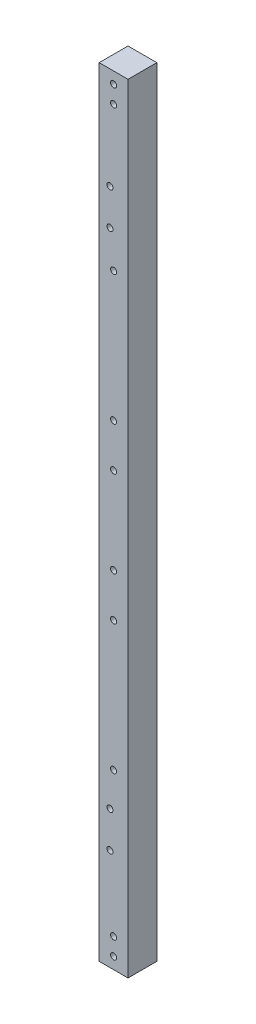
ISO-10303-21;
HEADER;
FILE_DESCRIPTION(('STEP AP214'),'2;1');
FILE_NAME('part.step','',(''),(''),'','','');
FILE_SCHEMA(('AUTOMOTIVE_DESIGN { 1 0 10303 214 1 1 1 1 }'));
ENDSEC;
DATA;
#1=APPLICATION_CONTEXT('core data for automotive mechanical design processes');
#2=APPLICATION_PROTOCOL_DEFINITION('international standard','automotive_design',2000,#1);
#3=PRODUCT_CONTEXT('',#1,'mechanical');
#4=PRODUCT('Part','Part','',(#3));
#5=PRODUCT_RELATED_PRODUCT_CATEGORY('part','',(#4));
#6=PRODUCT_DEFINITION_FORMATION('','',#4);
#7=PRODUCT_DEFINITION_CONTEXT('part definition',#1,'design');
#8=PRODUCT_DEFINITION('design','',#6,#7);
#9=PRODUCT_DEFINITION_SHAPE('','',#8);
#10=(LENGTH_UNIT() NAMED_UNIT(*) SI_UNIT(.MILLI.,.METRE.));
#11=(NAMED_UNIT(*) PLANE_ANGLE_UNIT() SI_UNIT($,.RADIAN.));
#12=(NAMED_UNIT(*) SI_UNIT($,.STERADIAN.) SOLID_ANGLE_UNIT());
#13=UNCERTAINTY_MEASURE_WITH_UNIT(LENGTH_MEASURE(1.E-05),#10,'distance_accuracy_value','');
#14=(GEOMETRIC_REPRESENTATION_CONTEXT(3) GLOBAL_UNCERTAINTY_ASSIGNED_CONTEXT((#13)) GLOBAL_UNIT_ASSIGNED_CONTEXT((#10,
#11,#12)) REPRESENTATION_CONTEXT('',''));
#15=CARTESIAN_POINT('',(0.,0.,0.));
#16=DIRECTION('',(0.,0.,1.));
#17=DIRECTION('',(1.,0.,0.));
#18=AXIS2_PLACEMENT_3D('',#15,#16,#17);
#19=CARTESIAN_POINT('',(-43.8461538461538,540.,-73.4615384615385));
#20=DIRECTION('',(1.,0.,0.));
#21=DIRECTION('',(0.,0.,-1.));
#22=AXIS2_PLACEMENT_3D('',#19,#20,#21);
#23=PLANE('',#22);
#24=DIRECTION('',(0.,0.,1.));
#25=VECTOR('',#24,1.);
#26=CARTESIAN_POINT('',(-43.8461538461538,0.,-73.4615384615385));
#27=LINE('',#26,#25);
#28=CARTESIAN_POINT('',(-43.8461538461538,0.,-73.4615384615385));
#29=VERTEX_POINT('',#28);
#30=CARTESIAN_POINT('',(-43.8461538461538,0.,-53.4615384615385));
#31=VERTEX_POINT('',#30);
#32=EDGE_CURVE('E104',#29,#31,#27,.T.);
#33=ORIENTED_EDGE('',*,*,#32,.T.);
#34=DIRECTION('',(0.,-1.,0.));
#35=VECTOR('',#34,1.);
#36=CARTESIAN_POINT('',(-43.8461538461538,540.,-53.4615384615385));
#37=LINE('',#36,#35);
#38=CARTESIAN_POINT('',(-43.8461538461538,540.,-53.4615384615385));
#39=VERTEX_POINT('',#38);
#40=EDGE_CURVE('E11',#39,#31,#37,.T.);
#41=ORIENTED_EDGE('',*,*,#40,.F.);
#42=DIRECTION('',(0.,0.,1.));
#43=VECTOR('',#42,1.);
#44=CARTESIAN_POINT('',(-43.8461538461538,540.,-73.4615384615385));
#45=LINE('',#44,#43);
#46=CARTESIAN_POINT('',(-43.8461538461538,540.,-73.4615384615385));
#47=VERTEX_POINT('',#46);
#48=EDGE_CURVE('E91',#47,#39,#45,.T.);
#49=ORIENTED_EDGE('',*,*,#48,.F.);
#50=DIRECTION('',(0.,-1.,0.));
#51=VECTOR('',#50,1.);
#52=CARTESIAN_POINT('',(-43.8461538461538,540.,-73.4615384615385));
#53=LINE('',#52,#51);
#54=EDGE_CURVE('E100',#47,#29,#53,.T.);
#55=ORIENTED_EDGE('',*,*,#54,.T.);
#56=EDGE_LOOP('',(#33,#41,#49,#55));
#57=FACE_BOUND('',#56,.T.);
#58=ADVANCED_FACE('F38',(#57),#23,.F.);
#59=CARTESIAN_POINT('',(-43.8461538461538,540.,-53.4615384615385));
#60=DIRECTION('',(0.,0.,-1.));
#61=DIRECTION('',(-1.,0.,0.));
#62=AXIS2_PLACEMENT_3D('',#59,#60,#61);
#63=PLANE('',#62);
#64=CARTESIAN_POINT('',(-33.8461538461538,8.,-53.4615384615385));
#65=DIRECTION('',(0.,0.,1.));
#66=DIRECTION('',(1.,0.,0.));
#67=AXIS2_PLACEMENT_3D('',#64,#65,#66);
#68=CIRCLE('',#67,2.1);
#69=CARTESIAN_POINT('',(-31.7461538461538,8.,-53.4615384615385));
#70=VERTEX_POINT('',#69);
#71=EDGE_CURVE('E117',#70,#70,#68,.T.);
#72=ORIENTED_EDGE('',*,*,#71,.F.);
#73=EDGE_LOOP('',(#72));
#74=FACE_BOUND('',#73,.T.);
#75=CARTESIAN_POINT('',(-33.8461538461538,20.,-53.4615384615385));
#76=DIRECTION('',(0.,0.,1.));
#77=DIRECTION('',(1.,0.,0.));
#78=AXIS2_PLACEMENT_3D('',#75,#76,#77);
#79=CIRCLE('',#78,2.1);
#80=CARTESIAN_POINT('',(-31.7461538461538,20.,-53.4615384615385));
#81=VERTEX_POINT('',#80);
#82=EDGE_CURVE('E254',#81,#81,#79,.T.);
#83=ORIENTED_EDGE('',*,*,#82,.F.);
#84=EDGE_LOOP('',(#83));
#85=FACE_BOUND('',#84,.T.);
#86=CARTESIAN_POINT('',(-33.8461538461538,520.,-53.4615384615385));
#87=DIRECTION('',(0.,0.,1.));
#88=DIRECTION('',(-1.,0.,0.));
#89=AXIS2_PLACEMENT_3D('',#86,#87,#88);
#90=CIRCLE('',#89,2.10000000000001);
#91=CARTESIAN_POINT('',(-35.9461538461538,520.,-53.4615384615385));
#92=VERTEX_POINT('',#91);
#93=EDGE_CURVE('E257',#92,#92,#90,.T.);
#94=ORIENTED_EDGE('',*,*,#93,.F.);
#95=EDGE_LOOP('',(#94));
#96=FACE_BOUND('',#95,.T.);
#97=CARTESIAN_POINT('',(-33.8461538461538,532.,-53.4615384615385));
#98=DIRECTION('',(0.,0.,1.));
#99=DIRECTION('',(-1.,0.,0.));
#100=AXIS2_PLACEMENT_3D('',#97,#98,#99);
#101=CIRCLE('',#100,2.09999999999998);
#102=CARTESIAN_POINT('',(-35.9461538461538,532.,-53.4615384615385));
#103=VERTEX_POINT('',#102);
#104=EDGE_CURVE('E262',#103,#103,#101,.T.);
#105=ORIENTED_EDGE('',*,*,#104,.F.);
#106=EDGE_LOOP('',(#105));
#107=FACE_BOUND('',#106,.T.);
#108=CARTESIAN_POINT('',(-36.3461538461538,70.5,-53.4615384615385));
#109=DIRECTION('',(0.,0.,1.));
#110=DIRECTION('',(1.,0.,0.));
#111=AXIS2_PLACEMENT_3D('',#108,#109,#110);
#112=CIRCLE('',#111,2.1);
#113=CARTESIAN_POINT('',(-34.2461538461538,70.5,-53.4615384615385));
#114=VERTEX_POINT('',#113);
#115=EDGE_CURVE('E267',#114,#114,#112,.T.);
#116=ORIENTED_EDGE('',*,*,#115,.F.);
#117=EDGE_LOOP('',(#116));
#118=FACE_BOUND('',#117,.T.);
#119=CARTESIAN_POINT('',(-36.3461538461538,95.5,-53.4615384615385));
#120=DIRECTION('',(0.,0.,1.));
#121=DIRECTION('',(1.,0.,0.));
#122=AXIS2_PLACEMENT_3D('',#119,#120,#121);
#123=CIRCLE('',#122,2.1);
#124=CARTESIAN_POINT('',(-34.2461538461538,95.5,-53.4615384615385));
#125=VERTEX_POINT('',#124);
#126=EDGE_CURVE('E273',#125,#125,#123,.T.);
#127=ORIENTED_EDGE('',*,*,#126,.F.);
#128=EDGE_LOOP('',(#127));
#129=FACE_BOUND('',#128,.T.);
#130=CARTESIAN_POINT('',(-36.3461538461538,444.5,-53.4615384615385));
#131=DIRECTION('',(0.,0.,1.));
#132=DIRECTION('',(-1.,0.,0.));
#133=AXIS2_PLACEMENT_3D('',#130,#131,#132);
#134=CIRCLE('',#133,2.09999999999999);
#135=CARTESIAN_POINT('',(-38.4461538461538,444.5,-53.4615384615385));
#136=VERTEX_POINT('',#135);
#137=EDGE_CURVE('E133',#136,#136,#134,.T.);
#138=ORIENTED_EDGE('',*,*,#137,.F.);
#139=EDGE_LOOP('',(#138));
#140=FACE_BOUND('',#139,.T.);
#141=CARTESIAN_POINT('',(-36.3461538461538,469.5,-53.4615384615385));
#142=DIRECTION('',(0.,0.,1.));
#143=DIRECTION('',(-1.,0.,0.));
#144=AXIS2_PLACEMENT_3D('',#141,#142,#143);
#145=CIRCLE('',#144,2.09999999999999);
#146=CARTESIAN_POINT('',(-38.4461538461538,469.5,-53.4615384615385));
#147=VERTEX_POINT('',#146);
#148=EDGE_CURVE('E124',#147,#147,#145,.T.);
#149=ORIENTED_EDGE('',*,*,#148,.F.);
#150=EDGE_LOOP('',(#149));
#151=FACE_BOUND('',#150,.T.);
#152=CARTESIAN_POINT('',(-33.8461538461538,120.,-53.4615384615385));
#153=DIRECTION('',(0.,0.,1.));
#154=DIRECTION('',(1.,0.,0.));
#155=AXIS2_PLACEMENT_3D('',#152,#153,#154);
#156=CIRCLE('',#155,2.1);
#157=CARTESIAN_POINT('',(-31.7461538461538,120.,-53.4615384615385));
#158=VERTEX_POINT('',#157);
#159=EDGE_CURVE('E165',#158,#158,#156,.T.);
#160=ORIENTED_EDGE('',*,*,#159,.F.);
#161=EDGE_LOOP('',(#160));
#162=FACE_BOUND('',#161,.T.);
#163=CARTESIAN_POINT('',(-33.8461538461538,210.,-53.4615384615385));
#164=DIRECTION('',(0.,0.,1.));
#165=DIRECTION('',(-1.,0.,0.));
#166=AXIS2_PLACEMENT_3D('',#163,#164,#165);
#167=CIRCLE('',#166,2.09999999999999);
#168=CARTESIAN_POINT('',(-35.9461538461538,210.,-53.4615384615385));
#169=VERTEX_POINT('',#168);
#170=EDGE_CURVE('E155',#169,#169,#167,.T.);
#171=ORIENTED_EDGE('',*,*,#170,.F.);
#172=EDGE_LOOP('',(#171));
#173=FACE_BOUND('',#172,.T.);
#174=CARTESIAN_POINT('',(-33.8461538461538,300.,-53.4615384615385));
#175=DIRECTION('',(0.,0.,1.));
#176=DIRECTION('',(1.,0.,0.));
#177=AXIS2_PLACEMENT_3D('',#174,#175,#176);
#178=CIRCLE('',#177,2.09999999999999);
#179=CARTESIAN_POINT('',(-31.7461538461538,300.,-53.4615384615385));
#180=VERTEX_POINT('',#179);
#181=EDGE_CURVE('E140',#180,#180,#178,.T.);
#182=ORIENTED_EDGE('',*,*,#181,.F.);
#183=EDGE_LOOP('',(#182));
#184=FACE_BOUND('',#183,.T.);
#185=CARTESIAN_POINT('',(-33.8461538461538,420.,-53.4615384615385));
#186=DIRECTION('',(0.,0.,1.));
#187=DIRECTION('',(1.,0.,0.));
#188=AXIS2_PLACEMENT_3D('',#185,#186,#187);
#189=CIRCLE('',#188,2.09999999999999);
#190=CARTESIAN_POINT('',(-31.7461538461538,420.,-53.4615384615385));
#191=VERTEX_POINT('',#190);
#192=EDGE_CURVE('E141',#191,#191,#189,.T.);
#193=ORIENTED_EDGE('',*,*,#192,.F.);
#194=EDGE_LOOP('',(#193));
#195=FACE_BOUND('',#194,.T.);
#196=CARTESIAN_POINT('',(-33.8461538461538,240.,-53.4615384615385));
#197=DIRECTION('',(0.,0.,1.));
#198=DIRECTION('',(1.,0.,0.));
#199=AXIS2_PLACEMENT_3D('',#196,#197,#198);
#200=CIRCLE('',#199,2.09999999999999);
#201=CARTESIAN_POINT('',(-31.7461538461538,240.,-53.4615384615385));
#202=VERTEX_POINT('',#201);
#203=EDGE_CURVE('E147',#202,#202,#200,.T.);
#204=ORIENTED_EDGE('',*,*,#203,.F.);
#205=EDGE_LOOP('',(#204));
#206=FACE_BOUND('',#205,.T.);
#207=CARTESIAN_POINT('',(-33.8461538461538,330.,-53.4615384615385));
#208=DIRECTION('',(0.,0.,1.));
#209=DIRECTION('',(1.,0.,0.));
#210=AXIS2_PLACEMENT_3D('',#207,#208,#209);
#211=CIRCLE('',#210,2.09999999999999);
#212=CARTESIAN_POINT('',(-31.7461538461538,330.,-53.4615384615385));
#213=VERTEX_POINT('',#212);
#214=EDGE_CURVE('E154',#213,#213,#211,.T.);
#215=ORIENTED_EDGE('',*,*,#214,.F.);
#216=EDGE_LOOP('',(#215));
#217=FACE_BOUND('',#216,.T.);
#218=DIRECTION('',(1.,0.,0.));
#219=VECTOR('',#218,1.);
#220=CARTESIAN_POINT('',(-43.8461538461538,0.,-53.4615384615385));
#221=LINE('',#220,#219);
#222=CARTESIAN_POINT('',(-23.8461538461538,0.,-53.4615384615385));
#223=VERTEX_POINT('',#222);
#224=EDGE_CURVE('E95',#31,#223,#221,.T.);
#225=ORIENTED_EDGE('',*,*,#224,.T.);
#226=DIRECTION('',(0.,-1.,0.));
#227=VECTOR('',#226,1.);
#228=CARTESIAN_POINT('',(-23.8461538461538,540.,-53.4615384615385));
#229=LINE('',#228,#227);
#230=CARTESIAN_POINT('',(-23.8461538461538,540.,-53.4615384615385));
#231=VERTEX_POINT('',#230);
#232=EDGE_CURVE('E47',#231,#223,#229,.T.);
#233=ORIENTED_EDGE('',*,*,#232,.F.);
#234=DIRECTION('',(1.,0.,0.));
#235=VECTOR('',#234,1.);
#236=CARTESIAN_POINT('',(-43.8461538461538,540.,-53.4615384615385));
#237=LINE('',#236,#235);
#238=EDGE_CURVE('E86',#39,#231,#237,.T.);
#239=ORIENTED_EDGE('',*,*,#238,.F.);
#240=ORIENTED_EDGE('',*,*,#40,.T.);
#241=EDGE_LOOP('',(#225,#233,#239,#240));
#242=FACE_BOUND('',#241,.T.);
#243=ADVANCED_FACE('F94',(#74,#85,#96,#107,#118,#129,#140,#151,#162,#173,#184,#195,#206,#217,
#242),#63,.F.);
#244=CARTESIAN_POINT('',(-23.8461538461538,540.,-73.4615384615385));
#245=DIRECTION('',(-1.,0.,0.));
#246=DIRECTION('',(0.,0.,1.));
#247=AXIS2_PLACEMENT_3D('',#244,#245,#246);
#248=PLANE('',#247);
#249=DIRECTION('',(0.,0.,-1.));
#250=VECTOR('',#249,1.);
#251=CARTESIAN_POINT('',(-23.8461538461538,0.,-73.4615384615385));
#252=LINE('',#251,#250);
#253=CARTESIAN_POINT('',(-23.8461538461538,0.,-73.4615384615385));
#254=VERTEX_POINT('',#253);
#255=EDGE_CURVE('E73',#223,#254,#252,.T.);
#256=ORIENTED_EDGE('',*,*,#255,.T.);
#257=DIRECTION('',(0.,-1.,0.));
#258=VECTOR('',#257,1.);
#259=CARTESIAN_POINT('',(-23.8461538461538,540.,-73.4615384615385));
#260=LINE('',#259,#258);
#261=CARTESIAN_POINT('',(-23.8461538461538,540.,-73.4615384615385));
#262=VERTEX_POINT('',#261);
#263=EDGE_CURVE('E96',#262,#254,#260,.T.);
#264=ORIENTED_EDGE('',*,*,#263,.F.);
#265=DIRECTION('',(0.,0.,-1.));
#266=VECTOR('',#265,1.);
#267=CARTESIAN_POINT('',(-23.8461538461538,540.,-73.4615384615385));
#268=LINE('',#267,#266);
#269=EDGE_CURVE('E89',#231,#262,#268,.T.);
#270=ORIENTED_EDGE('',*,*,#269,.F.);
#271=ORIENTED_EDGE('',*,*,#232,.T.);
#272=EDGE_LOOP('',(#256,#264,#270,#271));
#273=FACE_BOUND('',#272,.T.);
#274=ADVANCED_FACE('F98',(#273),#248,.F.);
#275=CARTESIAN_POINT('',(-43.8461538461538,540.,-73.4615384615385));
#276=DIRECTION('',(0.,0.,1.));
#277=DIRECTION('',(1.,0.,0.));
#278=AXIS2_PLACEMENT_3D('',#275,#276,#277);
#279=PLANE('',#278);
#280=CARTESIAN_POINT('',(-33.8461538461538,8.,-73.4615384615385));
#281=DIRECTION('',(0.,0.,1.));
#282=DIRECTION('',(1.,0.,0.));
#283=AXIS2_PLACEMENT_3D('',#280,#281,#282);
#284=CIRCLE('',#283,2.1);
#285=CARTESIAN_POINT('',(-31.7461538461538,8.,-73.4615384615385));
#286=VERTEX_POINT('',#285);
#287=EDGE_CURVE('E41',#286,#286,#284,.T.);
#288=ORIENTED_EDGE('',*,*,#287,.T.);
#289=EDGE_LOOP('',(#288));
#290=FACE_BOUND('',#289,.T.);
#291=CARTESIAN_POINT('',(-33.8461538461538,20.,-73.4615384615385));
#292=DIRECTION('',(0.,0.,1.));
#293=DIRECTION('',(1.,0.,0.));
#294=AXIS2_PLACEMENT_3D('',#291,#292,#293);
#295=CIRCLE('',#294,2.1);
#296=CARTESIAN_POINT('',(-31.7461538461538,20.,-73.4615384615385));
#297=VERTEX_POINT('',#296);
#298=EDGE_CURVE('E119',#297,#297,#295,.T.);
#299=ORIENTED_EDGE('',*,*,#298,.T.);
#300=EDGE_LOOP('',(#299));
#301=FACE_BOUND('',#300,.T.);
#302=CARTESIAN_POINT('',(-33.8461538461538,520.,-73.4615384615385));
#303=DIRECTION('',(0.,0.,1.));
#304=DIRECTION('',(1.,0.,0.));
#305=AXIS2_PLACEMENT_3D('',#302,#303,#304);
#306=CIRCLE('',#305,2.10000000000001);
#307=CARTESIAN_POINT('',(-31.7461538461538,520.,-73.4615384615385));
#308=VERTEX_POINT('',#307);
#309=EDGE_CURVE('E116',#308,#308,#306,.T.);
#310=ORIENTED_EDGE('',*,*,#309,.T.);
#311=EDGE_LOOP('',(#310));
#312=FACE_BOUND('',#311,.T.);
#313=CARTESIAN_POINT('',(-33.8461538461538,532.,-73.4615384615385));
#314=DIRECTION('',(0.,0.,1.));
#315=DIRECTION('',(1.,0.,0.));
#316=AXIS2_PLACEMENT_3D('',#313,#314,#315);
#317=CIRCLE('',#316,2.09999999999998);
#318=CARTESIAN_POINT('',(-31.7461538461539,532.,-73.4615384615385));
#319=VERTEX_POINT('',#318);
#320=EDGE_CURVE('E113',#319,#319,#317,.T.);
#321=ORIENTED_EDGE('',*,*,#320,.T.);
#322=EDGE_LOOP('',(#321));
#323=FACE_BOUND('',#322,.T.);
#324=CARTESIAN_POINT('',(-36.3461538461538,70.5,-73.4615384615385));
#325=DIRECTION('',(0.,0.,1.));
#326=DIRECTION('',(1.,0.,0.));
#327=AXIS2_PLACEMENT_3D('',#324,#325,#326);
#328=CIRCLE('',#327,2.1);
#329=CARTESIAN_POINT('',(-34.2461538461538,70.5,-73.4615384615385));
#330=VERTEX_POINT('',#329);
#331=EDGE_CURVE('E168',#330,#330,#328,.T.);
#332=ORIENTED_EDGE('',*,*,#331,.T.);
#333=EDGE_LOOP('',(#332));
#334=FACE_BOUND('',#333,.T.);
#335=CARTESIAN_POINT('',(-36.3461538461538,95.5,-73.4615384615385));
#336=DIRECTION('',(0.,0.,1.));
#337=DIRECTION('',(1.,0.,0.));
#338=AXIS2_PLACEMENT_3D('',#335,#336,#337);
#339=CIRCLE('',#338,2.1);
#340=CARTESIAN_POINT('',(-34.2461538461538,95.5,-73.4615384615385));
#341=VERTEX_POINT('',#340);
#342=EDGE_CURVE('E270',#341,#341,#339,.T.);
#343=ORIENTED_EDGE('',*,*,#342,.T.);
#344=EDGE_LOOP('',(#343));
#345=FACE_BOUND('',#344,.T.);
#346=CARTESIAN_POINT('',(-36.3461538461538,444.5,-73.4615384615385));
#347=DIRECTION('',(0.,0.,1.));
#348=DIRECTION('',(-1.,0.,0.));
#349=AXIS2_PLACEMENT_3D('',#346,#347,#348);
#350=CIRCLE('',#349,2.09999999999999);
#351=CARTESIAN_POINT('',(-38.4461538461538,444.5,-73.4615384615385));
#352=VERTEX_POINT('',#351);
#353=EDGE_CURVE('E276',#352,#352,#350,.T.);
#354=ORIENTED_EDGE('',*,*,#353,.T.);
#355=EDGE_LOOP('',(#354));
#356=FACE_BOUND('',#355,.T.);
#357=CARTESIAN_POINT('',(-36.3461538461538,469.5,-73.4615384615385));
#358=DIRECTION('',(0.,0.,1.));
#359=DIRECTION('',(-1.,0.,0.));
#360=AXIS2_PLACEMENT_3D('',#357,#358,#359);
#361=CIRCLE('',#360,2.09999999999999);
#362=CARTESIAN_POINT('',(-38.4461538461538,469.5,-73.4615384615385));
#363=VERTEX_POINT('',#362);
#364=EDGE_CURVE('E128',#363,#363,#361,.T.);
#365=ORIENTED_EDGE('',*,*,#364,.T.);
#366=EDGE_LOOP('',(#365));
#367=FACE_BOUND('',#366,.T.);
#368=CARTESIAN_POINT('',(-33.8461538461538,120.,-73.4615384615385));
#369=DIRECTION('',(0.,0.,1.));
#370=DIRECTION('',(1.,0.,0.));
#371=AXIS2_PLACEMENT_3D('',#368,#369,#370);
#372=CIRCLE('',#371,2.1);
#373=CARTESIAN_POINT('',(-31.7461538461538,120.,-73.4615384615385));
#374=VERTEX_POINT('',#373);
#375=EDGE_CURVE('E150',#374,#374,#372,.T.);
#376=ORIENTED_EDGE('',*,*,#375,.T.);
#377=EDGE_LOOP('',(#376));
#378=FACE_BOUND('',#377,.T.);
#379=CARTESIAN_POINT('',(-33.8461538461538,210.,-73.4615384615385));
#380=DIRECTION('',(0.,0.,1.));
#381=DIRECTION('',(-1.,0.,0.));
#382=AXIS2_PLACEMENT_3D('',#379,#380,#381);
#383=CIRCLE('',#382,2.09999999999999);
#384=CARTESIAN_POINT('',(-35.9461538461538,210.,-73.4615384615385));
#385=VERTEX_POINT('',#384);
#386=EDGE_CURVE('E151',#385,#385,#383,.T.);
#387=ORIENTED_EDGE('',*,*,#386,.T.);
#388=EDGE_LOOP('',(#387));
#389=FACE_BOUND('',#388,.T.);
#390=CARTESIAN_POINT('',(-33.8461538461538,300.,-73.4615384615385));
#391=DIRECTION('',(0.,0.,1.));
#392=DIRECTION('',(1.,0.,0.));
#393=AXIS2_PLACEMENT_3D('',#390,#391,#392);
#394=CIRCLE('',#393,2.09999999999999);
#395=CARTESIAN_POINT('',(-31.7461538461538,300.,-73.4615384615385));
#396=VERTEX_POINT('',#395);
#397=EDGE_CURVE('E158',#396,#396,#394,.T.);
#398=ORIENTED_EDGE('',*,*,#397,.T.);
#399=EDGE_LOOP('',(#398));
#400=FACE_BOUND('',#399,.T.);
#401=CARTESIAN_POINT('',(-33.8461538461538,420.,-73.4615384615385));
#402=DIRECTION('',(0.,0.,1.));
#403=DIRECTION('',(1.,0.,0.));
#404=AXIS2_PLACEMENT_3D('',#401,#402,#403);
#405=CIRCLE('',#404,2.09999999999999);
#406=CARTESIAN_POINT('',(-31.7461538461538,420.,-73.4615384615385));
#407=VERTEX_POINT('',#406);
#408=EDGE_CURVE('E137',#407,#407,#405,.T.);
#409=ORIENTED_EDGE('',*,*,#408,.T.);
#410=EDGE_LOOP('',(#409));
#411=FACE_BOUND('',#410,.T.);
#412=CARTESIAN_POINT('',(-33.8461538461538,240.,-73.4615384615385));
#413=DIRECTION('',(0.,0.,1.));
#414=DIRECTION('',(1.,0.,0.));
#415=AXIS2_PLACEMENT_3D('',#412,#413,#414);
#416=CIRCLE('',#415,2.09999999999999);
#417=CARTESIAN_POINT('',(-31.7461538461538,240.,-73.4615384615385));
#418=VERTEX_POINT('',#417);
#419=EDGE_CURVE('E144',#418,#418,#416,.T.);
#420=ORIENTED_EDGE('',*,*,#419,.T.);
#421=EDGE_LOOP('',(#420));
#422=FACE_BOUND('',#421,.T.);
#423=CARTESIAN_POINT('',(-33.8461538461538,330.,-73.4615384615385));
#424=DIRECTION('',(0.,0.,1.));
#425=DIRECTION('',(1.,0.,0.));
#426=AXIS2_PLACEMENT_3D('',#423,#424,#425);
#427=CIRCLE('',#426,2.09999999999999);
#428=CARTESIAN_POINT('',(-31.7461538461538,330.,-73.4615384615385));
#429=VERTEX_POINT('',#428);
#430=EDGE_CURVE('E107',#429,#429,#427,.T.);
#431=ORIENTED_EDGE('',*,*,#430,.T.);
#432=EDGE_LOOP('',(#431));
#433=FACE_BOUND('',#432,.T.);
#434=DIRECTION('',(-1.,0.,0.));
#435=VECTOR('',#434,1.);
#436=CARTESIAN_POINT('',(-43.8461538461538,0.,-73.4615384615385));
#437=LINE('',#436,#435);
#438=EDGE_CURVE('E79',#254,#29,#437,.T.);
#439=ORIENTED_EDGE('',*,*,#438,.T.);
#440=ORIENTED_EDGE('',*,*,#54,.F.);
#441=DIRECTION('',(-1.,0.,0.));
#442=VECTOR('',#441,1.);
#443=CARTESIAN_POINT('',(-43.8461538461538,540.,-73.4615384615385));
#444=LINE('',#443,#442);
#445=EDGE_CURVE('E56',#262,#47,#444,.T.);
#446=ORIENTED_EDGE('',*,*,#445,.F.);
#447=ORIENTED_EDGE('',*,*,#263,.T.);
#448=EDGE_LOOP('',(#439,#440,#446,#447));
#449=FACE_BOUND('',#448,.T.);
#450=ADVANCED_FACE('F182',(#290,#301,#312,#323,#334,#345,#356,#367,#378,#389,#400,#411,#422,
#433,#449),#279,.F.);
#451=CARTESIAN_POINT('',(0.,540.,0.));
#452=DIRECTION('',(0.,1.,0.));
#453=DIRECTION('',(0.,0.,1.));
#454=AXIS2_PLACEMENT_3D('',#451,#452,#453);
#455=PLANE('',#454);
#456=ORIENTED_EDGE('',*,*,#48,.T.);
#457=ORIENTED_EDGE('',*,*,#238,.T.);
#458=ORIENTED_EDGE('',*,*,#269,.T.);
#459=ORIENTED_EDGE('',*,*,#445,.T.);
#460=EDGE_LOOP('',(#456,#457,#458,#459));
#461=FACE_BOUND('',#460,.T.);
#462=ADVANCED_FACE('F87',(#461),#455,.T.);
#463=CARTESIAN_POINT('',(0.,0.,0.));
#464=DIRECTION('',(0.,1.,0.));
#465=DIRECTION('',(0.,0.,1.));
#466=AXIS2_PLACEMENT_3D('',#463,#464,#465);
#467=PLANE('',#466);
#468=ORIENTED_EDGE('',*,*,#32,.F.);
#469=ORIENTED_EDGE('',*,*,#438,.F.);
#470=ORIENTED_EDGE('',*,*,#255,.F.);
#471=ORIENTED_EDGE('',*,*,#224,.F.);
#472=EDGE_LOOP('',(#468,#469,#470,#471));
#473=FACE_BOUND('',#472,.T.);
#474=ADVANCED_FACE('F190',(#473),#467,.F.);
#475=CARTESIAN_POINT('',(-33.8461538461538,330.,-73.4615384615385));
#476=DIRECTION('',(0.,0.,1.));
#477=DIRECTION('',(1.,0.,0.));
#478=AXIS2_PLACEMENT_3D('',#475,#476,#477);
#479=CYLINDRICAL_SURFACE('',#478,2.09999999999999);
#480=ORIENTED_EDGE('',*,*,#430,.F.);
#481=EDGE_LOOP('',(#480));
#482=FACE_BOUND('',#481,.T.);
#483=ORIENTED_EDGE('',*,*,#214,.T.);
#484=EDGE_LOOP('',(#483));
#485=FACE_BOUND('',#484,.T.);
#486=ADVANCED_FACE('F174',(#482,#485),#479,.F.);
#487=CARTESIAN_POINT('',(-33.8461538461538,240.,-73.4615384615385));
#488=DIRECTION('',(0.,0.,1.));
#489=DIRECTION('',(1.,0.,0.));
#490=AXIS2_PLACEMENT_3D('',#487,#488,#489);
#491=CYLINDRICAL_SURFACE('',#490,2.09999999999999);
#492=ORIENTED_EDGE('',*,*,#419,.F.);
#493=EDGE_LOOP('',(#492));
#494=FACE_BOUND('',#493,.T.);
#495=ORIENTED_EDGE('',*,*,#203,.T.);
#496=EDGE_LOOP('',(#495));
#497=FACE_BOUND('',#496,.T.);
#498=ADVANCED_FACE('F198',(#494,#497),#491,.F.);
#499=CARTESIAN_POINT('',(-33.8461538461538,420.,-73.4615384615385));
#500=DIRECTION('',(0.,0.,1.));
#501=DIRECTION('',(1.,0.,0.));
#502=AXIS2_PLACEMENT_3D('',#499,#500,#501);
#503=CYLINDRICAL_SURFACE('',#502,2.09999999999999);
#504=ORIENTED_EDGE('',*,*,#408,.F.);
#505=EDGE_LOOP('',(#504));
#506=FACE_BOUND('',#505,.T.);
#507=ORIENTED_EDGE('',*,*,#192,.T.);
#508=EDGE_LOOP('',(#507));
#509=FACE_BOUND('',#508,.T.);
#510=ADVANCED_FACE('F209',(#506,#509),#503,.F.);
#511=CARTESIAN_POINT('',(-33.8461538461538,300.,-73.4615384615385));
#512=DIRECTION('',(0.,0.,1.));
#513=DIRECTION('',(1.,0.,0.));
#514=AXIS2_PLACEMENT_3D('',#511,#512,#513);
#515=CYLINDRICAL_SURFACE('',#514,2.09999999999999);
#516=ORIENTED_EDGE('',*,*,#397,.F.);
#517=EDGE_LOOP('',(#516));
#518=FACE_BOUND('',#517,.T.);
#519=ORIENTED_EDGE('',*,*,#181,.T.);
#520=EDGE_LOOP('',(#519));
#521=FACE_BOUND('',#520,.T.);
#522=ADVANCED_FACE('F206',(#518,#521),#515,.F.);
#523=CARTESIAN_POINT('',(-33.8461538461538,210.,-73.4615384615385));
#524=DIRECTION('',(0.,0.,1.));
#525=DIRECTION('',(1.,0.,0.));
#526=AXIS2_PLACEMENT_3D('',#523,#524,#525);
#527=CYLINDRICAL_SURFACE('',#526,2.09999999999999);
#528=ORIENTED_EDGE('',*,*,#386,.F.);
#529=EDGE_LOOP('',(#528));
#530=FACE_BOUND('',#529,.T.);
#531=ORIENTED_EDGE('',*,*,#170,.T.);
#532=EDGE_LOOP('',(#531));
#533=FACE_BOUND('',#532,.T.);
#534=ADVANCED_FACE('F204',(#530,#533),#527,.F.);
#535=CARTESIAN_POINT('',(-33.8461538461538,120.,-73.4615384615385));
#536=DIRECTION('',(0.,0.,1.));
#537=DIRECTION('',(1.,0.,0.));
#538=AXIS2_PLACEMENT_3D('',#535,#536,#537);
#539=CYLINDRICAL_SURFACE('',#538,2.1);
#540=ORIENTED_EDGE('',*,*,#375,.F.);
#541=EDGE_LOOP('',(#540));
#542=FACE_BOUND('',#541,.T.);
#543=ORIENTED_EDGE('',*,*,#159,.T.);
#544=EDGE_LOOP('',(#543));
#545=FACE_BOUND('',#544,.T.);
#546=ADVANCED_FACE('F200',(#542,#545),#539,.F.);
#547=CARTESIAN_POINT('',(-36.3461538461538,469.5,-73.4615384615385));
#548=DIRECTION('',(0.,0.,1.));
#549=DIRECTION('',(1.,0.,0.));
#550=AXIS2_PLACEMENT_3D('',#547,#548,#549);
#551=CYLINDRICAL_SURFACE('',#550,2.09999999999999);
#552=ORIENTED_EDGE('',*,*,#364,.F.);
#553=EDGE_LOOP('',(#552));
#554=FACE_BOUND('',#553,.T.);
#555=ORIENTED_EDGE('',*,*,#148,.T.);
#556=EDGE_LOOP('',(#555));
#557=FACE_BOUND('',#556,.T.);
#558=ADVANCED_FACE('F203',(#554,#557),#551,.F.);
#559=CARTESIAN_POINT('',(-36.3461538461538,444.5,-73.4615384615385));
#560=DIRECTION('',(0.,0.,1.));
#561=DIRECTION('',(1.,0.,0.));
#562=AXIS2_PLACEMENT_3D('',#559,#560,#561);
#563=CYLINDRICAL_SURFACE('',#562,2.09999999999999);
#564=ORIENTED_EDGE('',*,*,#353,.F.);
#565=EDGE_LOOP('',(#564));
#566=FACE_BOUND('',#565,.T.);
#567=ORIENTED_EDGE('',*,*,#137,.T.);
#568=EDGE_LOOP('',(#567));
#569=FACE_BOUND('',#568,.T.);
#570=ADVANCED_FACE('F222',(#566,#569),#563,.F.);
#571=CARTESIAN_POINT('',(-36.3461538461538,95.5,-73.4615384615385));
#572=DIRECTION('',(0.,0.,1.));
#573=DIRECTION('',(1.,0.,0.));
#574=AXIS2_PLACEMENT_3D('',#571,#572,#573);
#575=CYLINDRICAL_SURFACE('',#574,2.1);
#576=ORIENTED_EDGE('',*,*,#342,.F.);
#577=EDGE_LOOP('',(#576));
#578=FACE_BOUND('',#577,.T.);
#579=ORIENTED_EDGE('',*,*,#126,.T.);
#580=EDGE_LOOP('',(#579));
#581=FACE_BOUND('',#580,.T.);
#582=ADVANCED_FACE('F226',(#578,#581),#575,.F.);
#583=CARTESIAN_POINT('',(-36.3461538461538,70.5,-73.4615384615385));
#584=DIRECTION('',(0.,0.,1.));
#585=DIRECTION('',(1.,0.,0.));
#586=AXIS2_PLACEMENT_3D('',#583,#584,#585);
#587=CYLINDRICAL_SURFACE('',#586,2.1);
#588=ORIENTED_EDGE('',*,*,#331,.F.);
#589=EDGE_LOOP('',(#588));
#590=FACE_BOUND('',#589,.T.);
#591=ORIENTED_EDGE('',*,*,#115,.T.);
#592=EDGE_LOOP('',(#591));
#593=FACE_BOUND('',#592,.T.);
#594=ADVANCED_FACE('F230',(#590,#593),#587,.F.);
#595=CARTESIAN_POINT('',(-33.8461538461538,532.,-193.461538461538));
#596=DIRECTION('',(0.,0.,1.));
#597=DIRECTION('',(1.,0.,0.));
#598=AXIS2_PLACEMENT_3D('',#595,#596,#597);
#599=CYLINDRICAL_SURFACE('',#598,2.09999999999998);
#600=ORIENTED_EDGE('',*,*,#104,.T.);
#601=EDGE_LOOP('',(#600));
#602=FACE_BOUND('',#601,.T.);
#603=ORIENTED_EDGE('',*,*,#320,.F.);
#604=EDGE_LOOP('',(#603));
#605=FACE_BOUND('',#604,.T.);
#606=ADVANCED_FACE('F234',(#602,#605),#599,.F.);
#607=CARTESIAN_POINT('',(-33.8461538461538,520.,-193.461538461538));
#608=DIRECTION('',(0.,0.,1.));
#609=DIRECTION('',(1.,0.,0.));
#610=AXIS2_PLACEMENT_3D('',#607,#608,#609);
#611=CYLINDRICAL_SURFACE('',#610,2.10000000000001);
#612=ORIENTED_EDGE('',*,*,#93,.T.);
#613=EDGE_LOOP('',(#612));
#614=FACE_BOUND('',#613,.T.);
#615=ORIENTED_EDGE('',*,*,#309,.F.);
#616=EDGE_LOOP('',(#615));
#617=FACE_BOUND('',#616,.T.);
#618=ADVANCED_FACE('F238',(#614,#617),#611,.F.);
#619=CARTESIAN_POINT('',(-33.8461538461538,20.,-193.461538461538));
#620=DIRECTION('',(0.,0.,1.));
#621=DIRECTION('',(1.,0.,0.));
#622=AXIS2_PLACEMENT_3D('',#619,#620,#621);
#623=CYLINDRICAL_SURFACE('',#622,2.1);
#624=ORIENTED_EDGE('',*,*,#82,.T.);
#625=EDGE_LOOP('',(#624));
#626=FACE_BOUND('',#625,.T.);
#627=ORIENTED_EDGE('',*,*,#298,.F.);
#628=EDGE_LOOP('',(#627));
#629=FACE_BOUND('',#628,.T.);
#630=ADVANCED_FACE('F242',(#626,#629),#623,.F.);
#631=CARTESIAN_POINT('',(-33.8461538461538,8.,-193.461538461538));
#632=DIRECTION('',(0.,0.,1.));
#633=DIRECTION('',(1.,0.,0.));
#634=AXIS2_PLACEMENT_3D('',#631,#632,#633);
#635=CYLINDRICAL_SURFACE('',#634,2.1);
#636=ORIENTED_EDGE('',*,*,#71,.T.);
#637=EDGE_LOOP('',(#636));
#638=FACE_BOUND('',#637,.T.);
#639=ORIENTED_EDGE('',*,*,#287,.F.);
#640=EDGE_LOOP('',(#639));
#641=FACE_BOUND('',#640,.T.);
#642=ADVANCED_FACE('F246',(#638,#641),#635,.F.);
#643=CLOSED_SHELL('',(#58,#243,#274,#450,#462,#474,#486,#498,#510,#522,#534,#546,#558,#570,#582,
#594,#606,#618,#630,#642));
#644=MANIFOLD_SOLID_BREP('B2',#643);
#645=ADVANCED_BREP_SHAPE_REPRESENTATION('',(#18,#644),#14);
#646=SHAPE_DEFINITION_REPRESENTATION(#9,#645);
ENDSEC;
END-ISO-10303-21;
